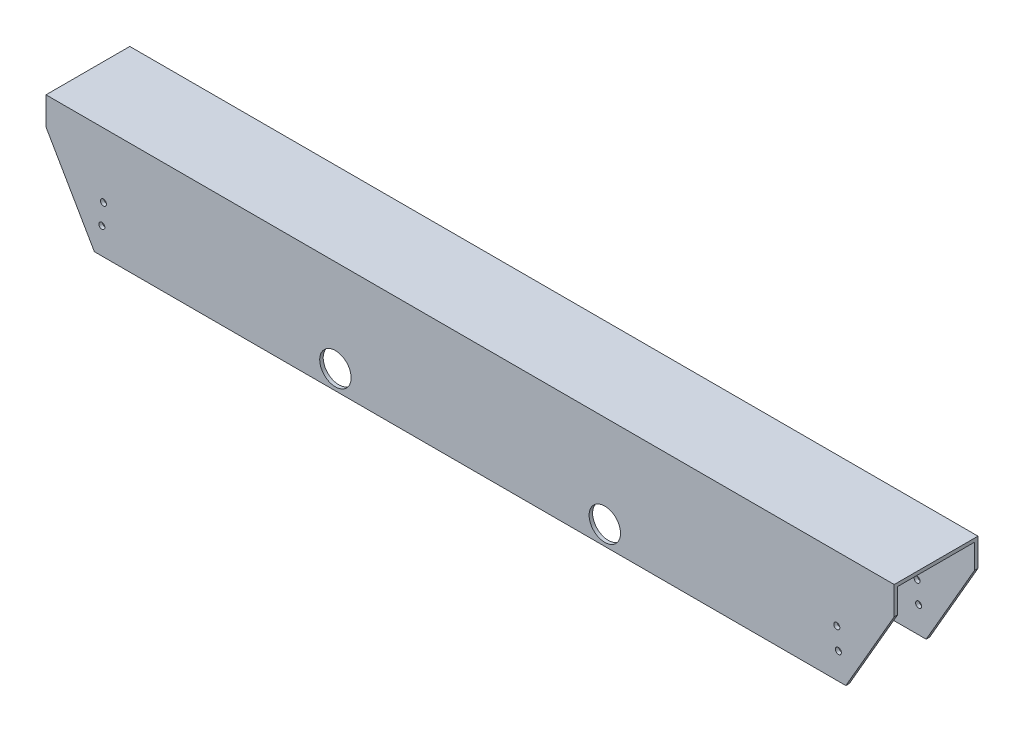
ISO-10303-21;
HEADER;
FILE_DESCRIPTION(('STEP AP214'),'2;1');
FILE_NAME('part.step','',(''),(''),'','','');
FILE_SCHEMA(('AUTOMOTIVE_DESIGN { 1 0 10303 214 1 1 1 1 }'));
ENDSEC;
DATA;
#1=APPLICATION_CONTEXT('core data for automotive mechanical design processes');
#2=APPLICATION_PROTOCOL_DEFINITION('international standard','automotive_design',2000,#1);
#3=PRODUCT_CONTEXT('',#1,'mechanical');
#4=PRODUCT('Part','Part','',(#3));
#5=PRODUCT_RELATED_PRODUCT_CATEGORY('part','',(#4));
#6=PRODUCT_DEFINITION_FORMATION('','',#4);
#7=PRODUCT_DEFINITION_CONTEXT('part definition',#1,'design');
#8=PRODUCT_DEFINITION('design','',#6,#7);
#9=PRODUCT_DEFINITION_SHAPE('','',#8);
#10=(LENGTH_UNIT() NAMED_UNIT(*) SI_UNIT(.MILLI.,.METRE.));
#11=(NAMED_UNIT(*) PLANE_ANGLE_UNIT() SI_UNIT($,.RADIAN.));
#12=(NAMED_UNIT(*) SI_UNIT($,.STERADIAN.) SOLID_ANGLE_UNIT());
#13=UNCERTAINTY_MEASURE_WITH_UNIT(LENGTH_MEASURE(1.E-05),#10,'distance_accuracy_value','');
#14=(GEOMETRIC_REPRESENTATION_CONTEXT(3) GLOBAL_UNCERTAINTY_ASSIGNED_CONTEXT((#13)) GLOBAL_UNIT_ASSIGNED_CONTEXT((#10,
#11,#12)) REPRESENTATION_CONTEXT('',''));
#15=CARTESIAN_POINT('',(0.,0.,0.));
#16=DIRECTION('',(0.,0.,1.));
#17=DIRECTION('',(1.,0.,0.));
#18=AXIS2_PLACEMENT_3D('',#15,#16,#17);
#19=CARTESIAN_POINT('',(385.705756272,50.8,-38.1));
#20=DIRECTION('',(0.,0.,1.));
#21=DIRECTION('',(0.,1.,0.));
#22=AXIS2_PLACEMENT_3D('',#19,#20,#21);
#23=PLANE('',#22);
#24=DIRECTION('',(0.,1.,0.));
#25=VECTOR('',#24,1.);
#26=CARTESIAN_POINT('',(0.,22.225,-38.1));
#27=LINE('',#26,#25);
#28=CARTESIAN_POINT('',(0.,22.225,-38.1));
#29=VERTEX_POINT('',#28);
#30=CARTESIAN_POINT('',(0.,47.625,-38.1));
#31=VERTEX_POINT('',#30);
#32=EDGE_CURVE('E360',#29,#31,#27,.T.);
#33=ORIENTED_EDGE('',*,*,#32,.F.);
#34=DIRECTION('',(-1.,0.,0.));
#35=VECTOR('',#34,1.);
#36=CARTESIAN_POINT('',(25.4,22.225,-38.1));
#37=LINE('',#36,#35);
#38=CARTESIAN_POINT('',(25.4,22.225,-38.1));
#39=VERTEX_POINT('',#38);
#40=EDGE_CURVE('E369',#39,#29,#37,.T.);
#41=ORIENTED_EDGE('',*,*,#40,.F.);
#42=DIRECTION('',(0.,-1.,0.));
#43=VECTOR('',#42,1.);
#44=CARTESIAN_POINT('',(25.4,22.225,-38.1));
#45=LINE('',#44,#43);
#46=CARTESIAN_POINT('',(25.4,47.625,-38.1));
#47=VERTEX_POINT('',#46);
#48=EDGE_CURVE('E366',#47,#39,#45,.T.);
#49=ORIENTED_EDGE('',*,*,#48,.F.);
#50=DIRECTION('',(1.,0.,0.));
#51=VECTOR('',#50,1.);
#52=CARTESIAN_POINT('',(25.4,47.625,-38.1));
#53=LINE('',#52,#51);
#54=EDGE_CURVE('E363',#31,#47,#53,.T.);
#55=ORIENTED_EDGE('',*,*,#54,.F.);
#56=EDGE_LOOP('',(#33,#41,#49,#55));
#57=FACE_BOUND('',#56,.T.);
#58=CARTESIAN_POINT('',(84.40039,-35.123476108,-38.1));
#59=DIRECTION('',(0.,0.,-1.));
#60=DIRECTION('',(-1.,0.,0.));
#61=AXIS2_PLACEMENT_3D('',#58,#59,#60);
#62=CIRCLE('',#61,3.302);
#63=CARTESIAN_POINT('',(81.09839,-35.123476108,-38.1));
#64=VERTEX_POINT('',#63);
#65=EDGE_CURVE('E254',#64,#64,#62,.T.);
#66=ORIENTED_EDGE('',*,*,#65,.F.);
#67=EDGE_LOOP('',(#66));
#68=FACE_BOUND('',#67,.T.);
#69=CARTESIAN_POINT('',(84.4118199998714,41.07652303475,-38.1));
#70=DIRECTION('',(0.,0.,-1.));
#71=DIRECTION('',(-1.,0.,0.));
#72=AXIS2_PLACEMENT_3D('',#69,#70,#71);
#73=CIRCLE('',#72,3.302);
#74=CARTESIAN_POINT('',(81.1098199998714,41.07652303475,-38.1));
#75=VERTEX_POINT('',#74);
#76=EDGE_CURVE('E250',#75,#75,#73,.T.);
#77=ORIENTED_EDGE('',*,*,#76,.F.);
#78=EDGE_LOOP('',(#77));
#79=FACE_BOUND('',#78,.T.);
#80=CARTESIAN_POINT('',(160.611819999871,41.07652303475,-38.1));
#81=DIRECTION('',(0.,0.,-1.));
#82=DIRECTION('',(-1.,0.,0.));
#83=AXIS2_PLACEMENT_3D('',#80,#81,#82);
#84=CIRCLE('',#83,3.30200000000001);
#85=CARTESIAN_POINT('',(157.309819999871,41.07652303475,-38.1));
#86=VERTEX_POINT('',#85);
#87=EDGE_CURVE('E246',#86,#86,#84,.T.);
#88=ORIENTED_EDGE('',*,*,#87,.F.);
#89=EDGE_LOOP('',(#88));
#90=FACE_BOUND('',#89,.T.);
#91=CARTESIAN_POINT('',(160.60039,-35.123476108,-38.1));
#92=DIRECTION('',(0.,0.,-1.));
#93=DIRECTION('',(-1.,0.,0.));
#94=AXIS2_PLACEMENT_3D('',#91,#92,#93);
#95=CIRCLE('',#94,3.30200000000001);
#96=CARTESIAN_POINT('',(157.29839,-35.123476108,-38.1));
#97=VERTEX_POINT('',#96);
#98=EDGE_CURVE('E242',#97,#97,#95,.T.);
#99=ORIENTED_EDGE('',*,*,#98,.F.);
#100=EDGE_LOOP('',(#99));
#101=FACE_BOUND('',#100,.T.);
#102=CARTESIAN_POINT('',(334.902632554865,-26.9275968191468,-38.1));
#103=DIRECTION('',(0.,0.,1.));
#104=DIRECTION('',(-1.,0.,0.));
#105=AXIS2_PLACEMENT_3D('',#102,#103,#104);
#106=CIRCLE('',#105,2.74999999999998);
#107=CARTESIAN_POINT('',(332.152632554865,-26.9275968191468,-38.1));
#108=VERTEX_POINT('',#107);
#109=EDGE_CURVE('E238',#108,#108,#106,.T.);
#110=ORIENTED_EDGE('',*,*,#109,.T.);
#111=EDGE_LOOP('',(#110));
#112=FACE_BOUND('',#111,.T.);
#113=CARTESIAN_POINT('',(-122.50039,-33.3375,-38.1));
#114=DIRECTION('',(0.,0.,1.));
#115=DIRECTION('',(1.,0.,0.));
#116=AXIS2_PLACEMENT_3D('',#113,#114,#115);
#117=CIRCLE('',#116,14.2875);
#118=CARTESIAN_POINT('',(-108.21289,-33.3375,-38.1));
#119=VERTEX_POINT('',#118);
#120=EDGE_CURVE('E233',#119,#119,#117,.T.);
#121=ORIENTED_EDGE('',*,*,#120,.T.);
#122=EDGE_LOOP('',(#121));
#123=FACE_BOUND('',#122,.T.);
#124=CARTESIAN_POINT('',(-334.902632554865,-26.9275968191468,-38.1));
#125=DIRECTION('',(0.,0.,1.));
#126=DIRECTION('',(1.,0.,0.));
#127=AXIS2_PLACEMENT_3D('',#124,#125,#126);
#128=CIRCLE('',#127,2.74999999999998);
#129=CARTESIAN_POINT('',(-332.152632554865,-26.9275968191468,-38.1));
#130=VERTEX_POINT('',#129);
#131=EDGE_CURVE('E228',#130,#130,#128,.T.);
#132=ORIENTED_EDGE('',*,*,#131,.T.);
#133=EDGE_LOOP('',(#132));
#134=FACE_BOUND('',#133,.T.);
#135=CARTESIAN_POINT('',(333.475837626314,-7.93749999999992,-38.1));
#136=DIRECTION('',(0.,0.,1.));
#137=DIRECTION('',(-1.,0.,0.));
#138=AXIS2_PLACEMENT_3D('',#135,#136,#137);
#139=CIRCLE('',#138,2.74999996099998);
#140=CARTESIAN_POINT('',(330.725837665314,-7.93749999999992,-38.1));
#141=VERTEX_POINT('',#140);
#142=EDGE_CURVE('E223',#141,#141,#139,.T.);
#143=ORIENTED_EDGE('',*,*,#142,.T.);
#144=EDGE_LOOP('',(#143));
#145=FACE_BOUND('',#144,.T.);
#146=CARTESIAN_POINT('',(122.50039,-33.3375,-38.1));
#147=DIRECTION('',(0.,0.,1.));
#148=DIRECTION('',(-1.,0.,0.));
#149=AXIS2_PLACEMENT_3D('',#146,#147,#148);
#150=CIRCLE('',#149,14.2875);
#151=CARTESIAN_POINT('',(108.21289,-33.3375,-38.1));
#152=VERTEX_POINT('',#151);
#153=EDGE_CURVE('E218',#152,#152,#150,.T.);
#154=ORIENTED_EDGE('',*,*,#153,.T.);
#155=EDGE_LOOP('',(#154));
#156=FACE_BOUND('',#155,.T.);
#157=CARTESIAN_POINT('',(-333.475837626314,-7.9375,-38.1));
#158=DIRECTION('',(0.,0.,1.));
#159=DIRECTION('',(1.,0.,0.));
#160=AXIS2_PLACEMENT_3D('',#157,#158,#159);
#161=CIRCLE('',#160,2.74999996099998);
#162=CARTESIAN_POINT('',(-330.725837665314,-7.9375,-38.1));
#163=VERTEX_POINT('',#162);
#164=EDGE_CURVE('E213',#163,#163,#161,.T.);
#165=ORIENTED_EDGE('',*,*,#164,.T.);
#166=EDGE_LOOP('',(#165));
#167=FACE_BOUND('',#166,.T.);
#168=DIRECTION('',(-1.,0.,0.));
#169=VECTOR('',#168,1.);
#170=CARTESIAN_POINT('',(385.705756272,-50.8,-38.1));
#171=LINE('',#170,#169);
#172=CARTESIAN_POINT('',(341.71166575975,-50.7999999999999,-38.1));
#173=VERTEX_POINT('',#172);
#174=CARTESIAN_POINT('',(-341.71166575975,-50.8,-38.1));
#175=VERTEX_POINT('',#174);
#176=EDGE_CURVE('E185',#173,#175,#171,.T.);
#177=ORIENTED_EDGE('',*,*,#176,.T.);
#178=DIRECTION('',(-0.500000000000004,0.866025403784436,0.));
#179=VECTOR('',#178,1.);
#180=CARTESIAN_POINT('',(-385.705756272,25.4,-38.1));
#181=LINE('',#180,#179);
#182=CARTESIAN_POINT('',(-385.705756272,25.4,-38.1));
#183=VERTEX_POINT('',#182);
#184=EDGE_CURVE('E448',#175,#183,#181,.T.);
#185=ORIENTED_EDGE('',*,*,#184,.T.);
#186=DIRECTION('',(0.,-1.,0.));
#187=VECTOR('',#186,1.);
#188=CARTESIAN_POINT('',(-385.705756272,50.8,-38.1));
#189=LINE('',#188,#187);
#190=CARTESIAN_POINT('',(-385.705756272,50.8,-38.1));
#191=VERTEX_POINT('',#190);
#192=EDGE_CURVE('E293',#191,#183,#189,.T.);
#193=ORIENTED_EDGE('',*,*,#192,.F.);
#194=DIRECTION('',(-1.,0.,0.));
#195=VECTOR('',#194,1.);
#196=CARTESIAN_POINT('',(385.705756272,50.8,-38.1));
#197=LINE('',#196,#195);
#198=CARTESIAN_POINT('',(385.705756272,50.8,-38.1));
#199=VERTEX_POINT('',#198);
#200=EDGE_CURVE('E193',#199,#191,#197,.T.);
#201=ORIENTED_EDGE('',*,*,#200,.F.);
#202=DIRECTION('',(0.,-1.,0.));
#203=VECTOR('',#202,1.);
#204=CARTESIAN_POINT('',(385.705756272,50.8,-38.1));
#205=LINE('',#204,#203);
#206=CARTESIAN_POINT('',(385.705756272,25.4000000000001,-38.1));
#207=VERTEX_POINT('',#206);
#208=EDGE_CURVE('E188',#199,#207,#205,.T.);
#209=ORIENTED_EDGE('',*,*,#208,.T.);
#210=DIRECTION('',(-0.500000000000004,-0.866025403784436,0.));
#211=VECTOR('',#210,1.);
#212=CARTESIAN_POINT('',(385.705756272,25.4000000000001,-38.1));
#213=LINE('',#212,#211);
#214=EDGE_CURVE('E172',#207,#173,#213,.T.);
#215=ORIENTED_EDGE('',*,*,#214,.T.);
#216=EDGE_LOOP('',(#177,#185,#193,#201,#209,#215));
#217=FACE_BOUND('',#216,.T.);
#218=DIRECTION('',(0.,1.,0.));
#219=VECTOR('',#218,1.);
#220=CARTESIAN_POINT('',(-292.1,22.225,-38.1));
#221=LINE('',#220,#219);
#222=CARTESIAN_POINT('',(-292.1,22.225,-38.1));
#223=VERTEX_POINT('',#222);
#224=CARTESIAN_POINT('',(-292.1,47.625,-38.1));
#225=VERTEX_POINT('',#224);
#226=EDGE_CURVE('E332',#223,#225,#221,.T.);
#227=ORIENTED_EDGE('',*,*,#226,.F.);
#228=DIRECTION('',(-1.,0.,0.));
#229=VECTOR('',#228,1.);
#230=CARTESIAN_POINT('',(-266.7,22.225,-38.1));
#231=LINE('',#230,#229);
#232=CARTESIAN_POINT('',(-266.7,22.225,-38.1));
#233=VERTEX_POINT('',#232);
#234=EDGE_CURVE('E346',#233,#223,#231,.T.);
#235=ORIENTED_EDGE('',*,*,#234,.F.);
#236=DIRECTION('',(0.,-1.,0.));
#237=VECTOR('',#236,1.);
#238=CARTESIAN_POINT('',(-266.7,22.225,-38.1));
#239=LINE('',#238,#237);
#240=CARTESIAN_POINT('',(-266.7,47.625,-38.1));
#241=VERTEX_POINT('',#240);
#242=EDGE_CURVE('E343',#241,#233,#239,.T.);
#243=ORIENTED_EDGE('',*,*,#242,.F.);
#244=DIRECTION('',(1.,0.,0.));
#245=VECTOR('',#244,1.);
#246=CARTESIAN_POINT('',(-266.7,47.625,-38.1));
#247=LINE('',#246,#245);
#248=EDGE_CURVE('E336',#225,#241,#247,.T.);
#249=ORIENTED_EDGE('',*,*,#248,.F.);
#250=EDGE_LOOP('',(#227,#235,#243,#249));
#251=FACE_BOUND('',#250,.T.);
#252=ADVANCED_FACE('F37',(#57,#68,#79,#90,#101,#112,#123,#134,#145,#156,#167,#217,#251),#23,.F.);
#253=CARTESIAN_POINT('',(385.705756272,47.625,-34.925));
#254=DIRECTION('',(0.,0.,-1.));
#255=DIRECTION('',(0.,-1.,0.));
#256=AXIS2_PLACEMENT_3D('',#253,#254,#255);
#257=PLANE('',#256);
#258=CARTESIAN_POINT('',(84.40039,-35.123476108,-34.925));
#259=DIRECTION('',(0.,0.,1.));
#260=DIRECTION('',(0.,-1.,0.));
#261=AXIS2_PLACEMENT_3D('',#258,#259,#260);
#262=CIRCLE('',#261,3.302);
#263=CARTESIAN_POINT('',(84.40039,-38.425476108,-34.925));
#264=VERTEX_POINT('',#263);
#265=EDGE_CURVE('E251',#264,#264,#262,.F.);
#266=ORIENTED_EDGE('',*,*,#265,.T.);
#267=EDGE_LOOP('',(#266));
#268=FACE_BOUND('',#267,.T.);
#269=CARTESIAN_POINT('',(84.4118199998714,41.07652303475,-34.925));
#270=DIRECTION('',(0.,0.,1.));
#271=DIRECTION('',(0.,-1.,0.));
#272=AXIS2_PLACEMENT_3D('',#269,#270,#271);
#273=CIRCLE('',#272,3.302);
#274=CARTESIAN_POINT('',(84.4118199998714,37.77452303475,-34.925));
#275=VERTEX_POINT('',#274);
#276=EDGE_CURVE('E247',#275,#275,#273,.F.);
#277=ORIENTED_EDGE('',*,*,#276,.T.);
#278=EDGE_LOOP('',(#277));
#279=FACE_BOUND('',#278,.T.);
#280=CARTESIAN_POINT('',(160.611819999871,41.07652303475,-34.925));
#281=DIRECTION('',(0.,0.,1.));
#282=DIRECTION('',(0.,-1.,0.));
#283=AXIS2_PLACEMENT_3D('',#280,#281,#282);
#284=CIRCLE('',#283,3.30200000000001);
#285=CARTESIAN_POINT('',(160.611819999871,37.77452303475,-34.925));
#286=VERTEX_POINT('',#285);
#287=EDGE_CURVE('E243',#286,#286,#284,.F.);
#288=ORIENTED_EDGE('',*,*,#287,.T.);
#289=EDGE_LOOP('',(#288));
#290=FACE_BOUND('',#289,.T.);
#291=CARTESIAN_POINT('',(160.60039,-35.123476108,-34.925));
#292=DIRECTION('',(0.,0.,1.));
#293=DIRECTION('',(0.,-1.,0.));
#294=AXIS2_PLACEMENT_3D('',#291,#292,#293);
#295=CIRCLE('',#294,3.30200000000001);
#296=CARTESIAN_POINT('',(160.60039,-38.425476108,-34.925));
#297=VERTEX_POINT('',#296);
#298=EDGE_CURVE('E239',#297,#297,#295,.F.);
#299=ORIENTED_EDGE('',*,*,#298,.T.);
#300=EDGE_LOOP('',(#299));
#301=FACE_BOUND('',#300,.T.);
#302=CARTESIAN_POINT('',(334.902632554865,-26.9275968191468,-34.925));
#303=DIRECTION('',(0.,0.,1.));
#304=DIRECTION('',(0.,-1.,0.));
#305=AXIS2_PLACEMENT_3D('',#302,#303,#304);
#306=CIRCLE('',#305,2.74999999999998);
#307=CARTESIAN_POINT('',(334.902632554865,-29.6775968191468,-34.925));
#308=VERTEX_POINT('',#307);
#309=EDGE_CURVE('E237',#308,#308,#306,.T.);
#310=ORIENTED_EDGE('',*,*,#309,.F.);
#311=EDGE_LOOP('',(#310));
#312=FACE_BOUND('',#311,.T.);
#313=CARTESIAN_POINT('',(-122.50039,-33.3375,-34.925));
#314=DIRECTION('',(0.,0.,1.));
#315=DIRECTION('',(0.,-1.,0.));
#316=AXIS2_PLACEMENT_3D('',#313,#314,#315);
#317=CIRCLE('',#316,14.2875);
#318=CARTESIAN_POINT('',(-122.50039,-47.625,-34.925));
#319=VERTEX_POINT('',#318);
#320=EDGE_CURVE('E232',#319,#319,#317,.T.);
#321=ORIENTED_EDGE('',*,*,#320,.F.);
#322=EDGE_LOOP('',(#321));
#323=FACE_BOUND('',#322,.T.);
#324=CARTESIAN_POINT('',(-334.902632554865,-26.9275968191468,-34.925));
#325=DIRECTION('',(0.,0.,1.));
#326=DIRECTION('',(0.,-1.,0.));
#327=AXIS2_PLACEMENT_3D('',#324,#325,#326);
#328=CIRCLE('',#327,2.74999999999998);
#329=CARTESIAN_POINT('',(-334.902632554865,-29.6775968191468,-34.925));
#330=VERTEX_POINT('',#329);
#331=EDGE_CURVE('E227',#330,#330,#328,.T.);
#332=ORIENTED_EDGE('',*,*,#331,.F.);
#333=EDGE_LOOP('',(#332));
#334=FACE_BOUND('',#333,.T.);
#335=CARTESIAN_POINT('',(333.475837626314,-7.93749999999992,-34.925));
#336=DIRECTION('',(0.,0.,1.));
#337=DIRECTION('',(0.,-1.,0.));
#338=AXIS2_PLACEMENT_3D('',#335,#336,#337);
#339=CIRCLE('',#338,2.74999996099998);
#340=CARTESIAN_POINT('',(333.475837626314,-10.6874999609999,-34.925));
#341=VERTEX_POINT('',#340);
#342=EDGE_CURVE('E222',#341,#341,#339,.T.);
#343=ORIENTED_EDGE('',*,*,#342,.F.);
#344=EDGE_LOOP('',(#343));
#345=FACE_BOUND('',#344,.T.);
#346=CARTESIAN_POINT('',(122.50039,-33.3375,-34.925));
#347=DIRECTION('',(0.,0.,1.));
#348=DIRECTION('',(0.,-1.,0.));
#349=AXIS2_PLACEMENT_3D('',#346,#347,#348);
#350=CIRCLE('',#349,14.2875);
#351=CARTESIAN_POINT('',(122.50039,-47.625,-34.925));
#352=VERTEX_POINT('',#351);
#353=EDGE_CURVE('E217',#352,#352,#350,.T.);
#354=ORIENTED_EDGE('',*,*,#353,.F.);
#355=EDGE_LOOP('',(#354));
#356=FACE_BOUND('',#355,.T.);
#357=CARTESIAN_POINT('',(-333.475837626314,-7.9375,-34.925));
#358=DIRECTION('',(0.,0.,1.));
#359=DIRECTION('',(0.,-1.,0.));
#360=AXIS2_PLACEMENT_3D('',#357,#358,#359);
#361=CIRCLE('',#360,2.74999996099998);
#362=CARTESIAN_POINT('',(-333.475837626314,-10.687499961,-34.925));
#363=VERTEX_POINT('',#362);
#364=EDGE_CURVE('E212',#363,#363,#361,.T.);
#365=ORIENTED_EDGE('',*,*,#364,.F.);
#366=EDGE_LOOP('',(#365));
#367=FACE_BOUND('',#366,.T.);
#368=DIRECTION('',(0.,1.,0.));
#369=VECTOR('',#368,1.);
#370=CARTESIAN_POINT('',(385.705756272,47.625,-34.925));
#371=LINE('',#370,#369);
#372=CARTESIAN_POINT('',(385.705756272,25.4000000000001,-34.925));
#373=VERTEX_POINT('',#372);
#374=CARTESIAN_POINT('',(385.705756272,47.625,-34.925));
#375=VERTEX_POINT('',#374);
#376=EDGE_CURVE('E271',#373,#375,#371,.T.);
#377=ORIENTED_EDGE('',*,*,#376,.T.);
#378=DIRECTION('',(-1.,0.,0.));
#379=VECTOR('',#378,1.);
#380=CARTESIAN_POINT('',(385.705756272,47.625,-34.925));
#381=LINE('',#380,#379);
#382=CARTESIAN_POINT('',(25.4,47.625,-34.925));
#383=VERTEX_POINT('',#382);
#384=EDGE_CURVE('E199',#375,#383,#381,.T.);
#385=ORIENTED_EDGE('',*,*,#384,.T.);
#386=DIRECTION('',(0.,-1.,0.));
#387=VECTOR('',#386,1.);
#388=CARTESIAN_POINT('',(25.4,47.625,-34.925));
#389=LINE('',#388,#387);
#390=CARTESIAN_POINT('',(25.4,22.225,-34.925));
#391=VERTEX_POINT('',#390);
#392=EDGE_CURVE('E380',#383,#391,#389,.T.);
#393=ORIENTED_EDGE('',*,*,#392,.T.);
#394=DIRECTION('',(-1.,0.,0.));
#395=VECTOR('',#394,1.);
#396=CARTESIAN_POINT('',(385.705756272,22.225,-34.925));
#397=LINE('',#396,#395);
#398=CARTESIAN_POINT('',(0.,22.225,-34.925));
#399=VERTEX_POINT('',#398);
#400=EDGE_CURVE('E208',#391,#399,#397,.T.);
#401=ORIENTED_EDGE('',*,*,#400,.T.);
#402=DIRECTION('',(0.,1.,0.));
#403=VECTOR('',#402,1.);
#404=CARTESIAN_POINT('',(0.,47.625,-34.925));
#405=LINE('',#404,#403);
#406=CARTESIAN_POINT('',(0.,47.625,-34.925));
#407=VERTEX_POINT('',#406);
#408=EDGE_CURVE('E382',#399,#407,#405,.T.);
#409=ORIENTED_EDGE('',*,*,#408,.T.);
#410=CARTESIAN_POINT('',(-266.7,47.625,-34.925));
#411=VERTEX_POINT('',#410);
#412=EDGE_CURVE('E309',#407,#411,#381,.T.);
#413=ORIENTED_EDGE('',*,*,#412,.T.);
#414=DIRECTION('',(0.,-1.,0.));
#415=VECTOR('',#414,1.);
#416=CARTESIAN_POINT('',(-266.7,47.625,-34.925));
#417=LINE('',#416,#415);
#418=CARTESIAN_POINT('',(-266.7,22.225,-34.925));
#419=VERTEX_POINT('',#418);
#420=EDGE_CURVE('E356',#411,#419,#417,.T.);
#421=ORIENTED_EDGE('',*,*,#420,.T.);
#422=DIRECTION('',(-1.,0.,0.));
#423=VECTOR('',#422,1.);
#424=CARTESIAN_POINT('',(385.705756272,22.225,-34.925));
#425=LINE('',#424,#423);
#426=CARTESIAN_POINT('',(-292.1,22.225,-34.925));
#427=VERTEX_POINT('',#426);
#428=EDGE_CURVE('E257',#419,#427,#425,.T.);
#429=ORIENTED_EDGE('',*,*,#428,.T.);
#430=DIRECTION('',(0.,1.,0.));
#431=VECTOR('',#430,1.);
#432=CARTESIAN_POINT('',(-292.1,47.625,-34.925));
#433=LINE('',#432,#431);
#434=CARTESIAN_POINT('',(-292.1,47.625,-34.925));
#435=VERTEX_POINT('',#434);
#436=EDGE_CURVE('E319',#427,#435,#433,.T.);
#437=ORIENTED_EDGE('',*,*,#436,.T.);
#438=CARTESIAN_POINT('',(-385.705756272,47.625,-34.925));
#439=VERTEX_POINT('',#438);
#440=EDGE_CURVE('E308',#435,#439,#381,.T.);
#441=ORIENTED_EDGE('',*,*,#440,.T.);
#442=DIRECTION('',(0.,1.,0.));
#443=VECTOR('',#442,1.);
#444=CARTESIAN_POINT('',(-385.705756272,47.625,-34.925));
#445=LINE('',#444,#443);
#446=CARTESIAN_POINT('',(-385.705756272,25.4,-34.925));
#447=VERTEX_POINT('',#446);
#448=EDGE_CURVE('E295',#447,#439,#445,.T.);
#449=ORIENTED_EDGE('',*,*,#448,.F.);
#450=DIRECTION('',(-0.500000000000004,0.866025403784436,0.));
#451=VECTOR('',#450,1.);
#452=CARTESIAN_POINT('',(-202.476585435551,-291.962233317443,-34.925));
#453=LINE('',#452,#451);
#454=CARTESIAN_POINT('',(-341.71166575975,-50.8,-34.925));
#455=VERTEX_POINT('',#454);
#456=EDGE_CURVE('E330',#455,#447,#453,.T.);
#457=ORIENTED_EDGE('',*,*,#456,.F.);
#458=DIRECTION('',(-1.,0.,0.));
#459=VECTOR('',#458,1.);
#460=CARTESIAN_POINT('',(385.705756272,-50.8,-34.925));
#461=LINE('',#460,#459);
#462=CARTESIAN_POINT('',(341.71166575975,-50.7999999999999,-34.925));
#463=VERTEX_POINT('',#462);
#464=EDGE_CURVE('E194',#463,#455,#461,.T.);
#465=ORIENTED_EDGE('',*,*,#464,.F.);
#466=DIRECTION('',(-0.500000000000004,-0.866025403784436,0.));
#467=VECTOR('',#466,1.);
#468=CARTESIAN_POINT('',(395.329463571555,42.0687499999999,-34.925));
#469=LINE('',#468,#467);
#470=EDGE_CURVE('E174',#373,#463,#469,.T.);
#471=ORIENTED_EDGE('',*,*,#470,.F.);
#472=EDGE_LOOP('',(#377,#385,#393,#401,#409,#413,#421,#429,#437,#441,#449,#457,#465,#471));
#473=FACE_BOUND('',#472,.T.);
#474=ADVANCED_FACE('F316',(#268,#279,#290,#301,#312,#323,#334,#345,#356,#367,#473),#257,.F.);
#475=CARTESIAN_POINT('',(385.705756272,-50.8,38.1));
#476=DIRECTION('',(0.,1.,0.));
#477=DIRECTION('',(0.,0.,-1.));
#478=AXIS2_PLACEMENT_3D('',#475,#476,#477);
#479=PLANE('',#478);
#480=DIRECTION('',(-1.,0.,0.));
#481=VECTOR('',#480,1.);
#482=CARTESIAN_POINT('',(385.705756272,-50.8,38.1));
#483=LINE('',#482,#481);
#484=CARTESIAN_POINT('',(341.71166575975,-50.7999999999999,38.1));
#485=VERTEX_POINT('',#484);
#486=CARTESIAN_POINT('',(-341.71166575975,-50.8,38.1));
#487=VERTEX_POINT('',#486);
#488=EDGE_CURVE('E205',#485,#487,#483,.T.);
#489=ORIENTED_EDGE('',*,*,#488,.T.);
#490=DIRECTION('',(0.,0.,-1.));
#491=VECTOR('',#490,1.);
#492=CARTESIAN_POINT('',(-341.71166575975,-50.8,63.5));
#493=LINE('',#492,#491);
#494=CARTESIAN_POINT('',(-341.71166575975,-50.8,34.925));
#495=VERTEX_POINT('',#494);
#496=EDGE_CURVE('E453',#487,#495,#493,.T.);
#497=ORIENTED_EDGE('',*,*,#496,.T.);
#498=DIRECTION('',(-1.,0.,0.));
#499=VECTOR('',#498,1.);
#500=CARTESIAN_POINT('',(385.705756272,-50.8,34.925));
#501=LINE('',#500,#499);
#502=CARTESIAN_POINT('',(341.71166575975,-50.7999999999999,34.925));
#503=VERTEX_POINT('',#502);
#504=EDGE_CURVE('E286',#503,#495,#501,.T.);
#505=ORIENTED_EDGE('',*,*,#504,.F.);
#506=DIRECTION('',(0.,0.,-1.));
#507=VECTOR('',#506,1.);
#508=CARTESIAN_POINT('',(341.71166575975,-50.7999999999999,63.5));
#509=LINE('',#508,#507);
#510=EDGE_CURVE('E179',#485,#503,#509,.T.);
#511=ORIENTED_EDGE('',*,*,#510,.F.);
#512=EDGE_LOOP('',(#489,#497,#505,#511));
#513=FACE_BOUND('',#512,.T.);
#514=ADVANCED_FACE('F39',(#513),#479,.F.);
#515=CARTESIAN_POINT('',(385.705756272,50.8,38.1));
#516=DIRECTION('',(0.,0.,-1.));
#517=DIRECTION('',(0.,-1.,0.));
#518=AXIS2_PLACEMENT_3D('',#515,#516,#517);
#519=PLANE('',#518);
#520=CARTESIAN_POINT('',(334.902632554865,-26.9275968191468,38.1));
#521=DIRECTION('',(0.,0.,1.));
#522=DIRECTION('',(0.,-1.,0.));
#523=AXIS2_PLACEMENT_3D('',#520,#521,#522);
#524=CIRCLE('',#523,2.74999999999998);
#525=CARTESIAN_POINT('',(334.902632554865,-29.6775968191468,38.1));
#526=VERTEX_POINT('',#525);
#527=EDGE_CURVE('E397',#526,#526,#524,.T.);
#528=ORIENTED_EDGE('',*,*,#527,.F.);
#529=EDGE_LOOP('',(#528));
#530=FACE_BOUND('',#529,.T.);
#531=CARTESIAN_POINT('',(-122.50039,-33.3375,38.1));
#532=DIRECTION('',(0.,0.,1.));
#533=DIRECTION('',(0.,-1.,0.));
#534=AXIS2_PLACEMENT_3D('',#531,#532,#533);
#535=CIRCLE('',#534,14.2875);
#536=CARTESIAN_POINT('',(-122.50039,-47.625,38.1));
#537=VERTEX_POINT('',#536);
#538=EDGE_CURVE('E404',#537,#537,#535,.T.);
#539=ORIENTED_EDGE('',*,*,#538,.F.);
#540=EDGE_LOOP('',(#539));
#541=FACE_BOUND('',#540,.T.);
#542=CARTESIAN_POINT('',(-334.902632554865,-26.9275968191468,38.1));
#543=DIRECTION('',(0.,0.,1.));
#544=DIRECTION('',(0.,-1.,0.));
#545=AXIS2_PLACEMENT_3D('',#542,#543,#544);
#546=CIRCLE('',#545,2.74999999999998);
#547=CARTESIAN_POINT('',(-334.902632554865,-29.6775968191468,38.1));
#548=VERTEX_POINT('',#547);
#549=EDGE_CURVE('E411',#548,#548,#546,.T.);
#550=ORIENTED_EDGE('',*,*,#549,.F.);
#551=EDGE_LOOP('',(#550));
#552=FACE_BOUND('',#551,.T.);
#553=CARTESIAN_POINT('',(333.475837626314,-7.93749999999992,38.1));
#554=DIRECTION('',(0.,0.,1.));
#555=DIRECTION('',(0.,-1.,0.));
#556=AXIS2_PLACEMENT_3D('',#553,#554,#555);
#557=CIRCLE('',#556,2.74999996099998);
#558=CARTESIAN_POINT('',(333.475837626314,-10.6874999609999,38.1));
#559=VERTEX_POINT('',#558);
#560=EDGE_CURVE('E418',#559,#559,#557,.T.);
#561=ORIENTED_EDGE('',*,*,#560,.F.);
#562=EDGE_LOOP('',(#561));
#563=FACE_BOUND('',#562,.T.);
#564=CARTESIAN_POINT('',(122.50039,-33.3375,38.1));
#565=DIRECTION('',(0.,0.,1.));
#566=DIRECTION('',(0.,-1.,0.));
#567=AXIS2_PLACEMENT_3D('',#564,#565,#566);
#568=CIRCLE('',#567,14.2875);
#569=CARTESIAN_POINT('',(122.50039,-47.625,38.1));
#570=VERTEX_POINT('',#569);
#571=EDGE_CURVE('E425',#570,#570,#568,.T.);
#572=ORIENTED_EDGE('',*,*,#571,.F.);
#573=EDGE_LOOP('',(#572));
#574=FACE_BOUND('',#573,.T.);
#575=CARTESIAN_POINT('',(-333.475837626314,-7.9375,38.1));
#576=DIRECTION('',(0.,0.,1.));
#577=DIRECTION('',(0.,-1.,0.));
#578=AXIS2_PLACEMENT_3D('',#575,#576,#577);
#579=CIRCLE('',#578,2.74999996099998);
#580=CARTESIAN_POINT('',(-333.475837626314,-10.687499961,38.1));
#581=VERTEX_POINT('',#580);
#582=EDGE_CURVE('E291',#581,#581,#579,.T.);
#583=ORIENTED_EDGE('',*,*,#582,.F.);
#584=EDGE_LOOP('',(#583));
#585=FACE_BOUND('',#584,.T.);
#586=DIRECTION('',(0.,1.,0.));
#587=VECTOR('',#586,1.);
#588=CARTESIAN_POINT('',(385.705756272,50.8,38.1));
#589=LINE('',#588,#587);
#590=CARTESIAN_POINT('',(385.705756272,25.4000000000001,38.1));
#591=VERTEX_POINT('',#590);
#592=CARTESIAN_POINT('',(385.705756272,50.8,38.1));
#593=VERTEX_POINT('',#592);
#594=EDGE_CURVE('E303',#591,#593,#589,.T.);
#595=ORIENTED_EDGE('',*,*,#594,.T.);
#596=DIRECTION('',(-1.,0.,0.));
#597=VECTOR('',#596,1.);
#598=CARTESIAN_POINT('',(385.705756272,50.8,38.1));
#599=LINE('',#598,#597);
#600=CARTESIAN_POINT('',(-385.705756272,50.8,38.1));
#601=VERTEX_POINT('',#600);
#602=EDGE_CURVE('E197',#593,#601,#599,.T.);
#603=ORIENTED_EDGE('',*,*,#602,.T.);
#604=DIRECTION('',(0.,1.,0.));
#605=VECTOR('',#604,1.);
#606=CARTESIAN_POINT('',(-385.705756272,50.8,38.1));
#607=LINE('',#606,#605);
#608=CARTESIAN_POINT('',(-385.705756272,25.4,38.1));
#609=VERTEX_POINT('',#608);
#610=EDGE_CURVE('E287',#609,#601,#607,.T.);
#611=ORIENTED_EDGE('',*,*,#610,.F.);
#612=DIRECTION('',(-0.500000000000004,0.866025403784436,0.));
#613=VECTOR('',#612,1.);
#614=CARTESIAN_POINT('',(-203.851400764059,-289.580983317443,38.1));
#615=LINE('',#614,#613);
#616=EDGE_CURVE('E333',#487,#609,#615,.T.);
#617=ORIENTED_EDGE('',*,*,#616,.F.);
#618=ORIENTED_EDGE('',*,*,#488,.F.);
#619=DIRECTION('',(-0.500000000000004,-0.866025403784436,0.));
#620=VECTOR('',#619,1.);
#621=CARTESIAN_POINT('',(396.704278900062,44.4499999999999,38.1));
#622=LINE('',#621,#620);
#623=EDGE_CURVE('E443',#591,#485,#622,.T.);
#624=ORIENTED_EDGE('',*,*,#623,.F.);
#625=EDGE_LOOP('',(#595,#603,#611,#617,#618,#624));
#626=FACE_BOUND('',#625,.T.);
#627=ADVANCED_FACE('F440',(#530,#541,#552,#563,#574,#585,#626),#519,.F.);
#628=CARTESIAN_POINT('',(385.705756272,50.8,-38.1));
#629=DIRECTION('',(0.,-1.,0.));
#630=DIRECTION('',(0.,0.,1.));
#631=AXIS2_PLACEMENT_3D('',#628,#629,#630);
#632=PLANE('',#631);
#633=DIRECTION('',(0.,0.,-1.));
#634=VECTOR('',#633,1.);
#635=CARTESIAN_POINT('',(-385.705756272,50.8,-38.1));
#636=LINE('',#635,#634);
#637=EDGE_CURVE('E290',#601,#191,#636,.T.);
#638=ORIENTED_EDGE('',*,*,#637,.F.);
#639=ORIENTED_EDGE('',*,*,#602,.F.);
#640=DIRECTION('',(0.,0.,-1.));
#641=VECTOR('',#640,1.);
#642=CARTESIAN_POINT('',(385.705756272,50.8,-38.1));
#643=LINE('',#642,#641);
#644=EDGE_CURVE('E280',#593,#199,#643,.T.);
#645=ORIENTED_EDGE('',*,*,#644,.T.);
#646=ORIENTED_EDGE('',*,*,#200,.T.);
#647=EDGE_LOOP('',(#638,#639,#645,#646));
#648=FACE_BOUND('',#647,.T.);
#649=ADVANCED_FACE('F437',(#648),#632,.F.);
#650=CARTESIAN_POINT('',(385.705756272,-50.8,-38.1));
#651=DIRECTION('',(0.,1.,0.));
#652=DIRECTION('',(0.,0.,-1.));
#653=AXIS2_PLACEMENT_3D('',#650,#651,#652);
#654=PLANE('',#653);
#655=ORIENTED_EDGE('',*,*,#464,.T.);
#656=EDGE_CURVE('E191',#455,#175,#493,.T.);
#657=ORIENTED_EDGE('',*,*,#656,.T.);
#658=ORIENTED_EDGE('',*,*,#176,.F.);
#659=EDGE_CURVE('E169',#463,#173,#509,.T.);
#660=ORIENTED_EDGE('',*,*,#659,.F.);
#661=EDGE_LOOP('',(#655,#657,#658,#660));
#662=FACE_BOUND('',#661,.T.);
#663=ADVANCED_FACE('F190',(#662),#654,.F.);
#664=CARTESIAN_POINT('',(385.705756272,47.625,-34.925));
#665=DIRECTION('',(0.,1.,0.));
#666=DIRECTION('',(0.,0.,-1.));
#667=AXIS2_PLACEMENT_3D('',#664,#665,#666);
#668=PLANE('',#667);
#669=ORIENTED_EDGE('',*,*,#412,.F.);
#670=DIRECTION('',(0.,0.,-1.));
#671=VECTOR('',#670,1.);
#672=CARTESIAN_POINT('',(0.,47.625,-4.85637699543683));
#673=LINE('',#672,#671);
#674=EDGE_CURVE('E378',#407,#31,#673,.T.);
#675=ORIENTED_EDGE('',*,*,#674,.T.);
#676=ORIENTED_EDGE('',*,*,#54,.T.);
#677=DIRECTION('',(0.,0.,-1.));
#678=VECTOR('',#677,1.);
#679=CARTESIAN_POINT('',(25.4,47.625,-4.85637699543683));
#680=LINE('',#679,#678);
#681=EDGE_CURVE('E376',#383,#47,#680,.T.);
#682=ORIENTED_EDGE('',*,*,#681,.F.);
#683=ORIENTED_EDGE('',*,*,#384,.F.);
#684=DIRECTION('',(0.,0.,1.));
#685=VECTOR('',#684,1.);
#686=CARTESIAN_POINT('',(385.705756272,47.625,-34.925));
#687=LINE('',#686,#685);
#688=CARTESIAN_POINT('',(385.705756272,47.625,34.925));
#689=VERTEX_POINT('',#688);
#690=EDGE_CURVE('E273',#375,#689,#687,.T.);
#691=ORIENTED_EDGE('',*,*,#690,.T.);
#692=DIRECTION('',(-1.,0.,0.));
#693=VECTOR('',#692,1.);
#694=CARTESIAN_POINT('',(385.705756272,47.625,34.925));
#695=LINE('',#694,#693);
#696=CARTESIAN_POINT('',(-385.705756272,47.625,34.925));
#697=VERTEX_POINT('',#696);
#698=EDGE_CURVE('E306',#689,#697,#695,.T.);
#699=ORIENTED_EDGE('',*,*,#698,.T.);
#700=DIRECTION('',(0.,0.,1.));
#701=VECTOR('',#700,1.);
#702=CARTESIAN_POINT('',(-385.705756272,47.625,-34.925));
#703=LINE('',#702,#701);
#704=EDGE_CURVE('E298',#439,#697,#703,.T.);
#705=ORIENTED_EDGE('',*,*,#704,.F.);
#706=ORIENTED_EDGE('',*,*,#440,.F.);
#707=DIRECTION('',(0.,0.,-1.));
#708=VECTOR('',#707,1.);
#709=CARTESIAN_POINT('',(-292.1,47.625,-4.85637699543683));
#710=LINE('',#709,#708);
#711=EDGE_CURVE('E324',#435,#225,#710,.T.);
#712=ORIENTED_EDGE('',*,*,#711,.T.);
#713=ORIENTED_EDGE('',*,*,#248,.T.);
#714=DIRECTION('',(0.,0.,-1.));
#715=VECTOR('',#714,1.);
#716=CARTESIAN_POINT('',(-266.7,47.625,-4.85637699543683));
#717=LINE('',#716,#715);
#718=EDGE_CURVE('E353',#411,#241,#717,.T.);
#719=ORIENTED_EDGE('',*,*,#718,.F.);
#720=EDGE_LOOP('',(#669,#675,#676,#682,#683,#691,#699,#705,#706,#712,#713,#719));
#721=FACE_BOUND('',#720,.T.);
#722=ADVANCED_FACE('F322',(#721),#668,.F.);
#723=CARTESIAN_POINT('',(385.705756272,47.625,34.925));
#724=DIRECTION('',(0.,0.,1.));
#725=DIRECTION('',(0.,1.,0.));
#726=AXIS2_PLACEMENT_3D('',#723,#724,#725);
#727=PLANE('',#726);
#728=CARTESIAN_POINT('',(334.902632554865,-26.9275968191468,34.925));
#729=DIRECTION('',(0.,0.,-1.));
#730=DIRECTION('',(0.,1.,0.));
#731=AXIS2_PLACEMENT_3D('',#728,#729,#730);
#732=CIRCLE('',#731,2.74999999999998);
#733=CARTESIAN_POINT('',(334.902632554865,-24.1775968191469,34.925));
#734=VERTEX_POINT('',#733);
#735=EDGE_CURVE('E234',#734,#734,#732,.T.);
#736=ORIENTED_EDGE('',*,*,#735,.F.);
#737=EDGE_LOOP('',(#736));
#738=FACE_BOUND('',#737,.T.);
#739=CARTESIAN_POINT('',(-122.50039,-33.3375,34.925));
#740=DIRECTION('',(0.,0.,-1.));
#741=DIRECTION('',(0.,1.,0.));
#742=AXIS2_PLACEMENT_3D('',#739,#740,#741);
#743=CIRCLE('',#742,14.2875);
#744=CARTESIAN_POINT('',(-122.50039,-19.05,34.925));
#745=VERTEX_POINT('',#744);
#746=EDGE_CURVE('E229',#745,#745,#743,.T.);
#747=ORIENTED_EDGE('',*,*,#746,.F.);
#748=EDGE_LOOP('',(#747));
#749=FACE_BOUND('',#748,.T.);
#750=CARTESIAN_POINT('',(-334.902632554865,-26.9275968191468,34.925));
#751=DIRECTION('',(0.,0.,-1.));
#752=DIRECTION('',(0.,1.,0.));
#753=AXIS2_PLACEMENT_3D('',#750,#751,#752);
#754=CIRCLE('',#753,2.74999999999998);
#755=CARTESIAN_POINT('',(-334.902632554865,-24.1775968191469,34.925));
#756=VERTEX_POINT('',#755);
#757=EDGE_CURVE('E224',#756,#756,#754,.T.);
#758=ORIENTED_EDGE('',*,*,#757,.F.);
#759=EDGE_LOOP('',(#758));
#760=FACE_BOUND('',#759,.T.);
#761=CARTESIAN_POINT('',(333.475837626314,-7.93749999999992,34.925));
#762=DIRECTION('',(0.,0.,-1.));
#763=DIRECTION('',(0.,1.,0.));
#764=AXIS2_PLACEMENT_3D('',#761,#762,#763);
#765=CIRCLE('',#764,2.74999996099998);
#766=CARTESIAN_POINT('',(333.475837626314,-5.18750003899994,34.925));
#767=VERTEX_POINT('',#766);
#768=EDGE_CURVE('E219',#767,#767,#765,.T.);
#769=ORIENTED_EDGE('',*,*,#768,.F.);
#770=EDGE_LOOP('',(#769));
#771=FACE_BOUND('',#770,.T.);
#772=CARTESIAN_POINT('',(122.50039,-33.3375,34.925));
#773=DIRECTION('',(0.,0.,-1.));
#774=DIRECTION('',(0.,1.,0.));
#775=AXIS2_PLACEMENT_3D('',#772,#773,#774);
#776=CIRCLE('',#775,14.2875);
#777=CARTESIAN_POINT('',(122.50039,-19.05,34.925));
#778=VERTEX_POINT('',#777);
#779=EDGE_CURVE('E214',#778,#778,#776,.T.);
#780=ORIENTED_EDGE('',*,*,#779,.F.);
#781=EDGE_LOOP('',(#780));
#782=FACE_BOUND('',#781,.T.);
#783=CARTESIAN_POINT('',(-333.475837626314,-7.9375,34.925));
#784=DIRECTION('',(0.,0.,-1.));
#785=DIRECTION('',(0.,1.,0.));
#786=AXIS2_PLACEMENT_3D('',#783,#784,#785);
#787=CIRCLE('',#786,2.74999996099998);
#788=CARTESIAN_POINT('',(-333.475837626314,-5.18750003900002,34.925));
#789=VERTEX_POINT('',#788);
#790=EDGE_CURVE('E209',#789,#789,#787,.T.);
#791=ORIENTED_EDGE('',*,*,#790,.F.);
#792=EDGE_LOOP('',(#791));
#793=FACE_BOUND('',#792,.T.);
#794=ORIENTED_EDGE('',*,*,#504,.T.);
#795=DIRECTION('',(0.500000000000004,-0.866025403784436,0.));
#796=VECTOR('',#795,1.);
#797=CARTESIAN_POINT('',(-202.476585435551,-291.962233317443,34.925));
#798=LINE('',#797,#796);
#799=CARTESIAN_POINT('',(-385.705756272,25.4,34.925));
#800=VERTEX_POINT('',#799);
#801=EDGE_CURVE('E338',#800,#495,#798,.T.);
#802=ORIENTED_EDGE('',*,*,#801,.F.);
#803=DIRECTION('',(0.,-1.,0.));
#804=VECTOR('',#803,1.);
#805=CARTESIAN_POINT('',(-385.705756272,47.625,34.925));
#806=LINE('',#805,#804);
#807=EDGE_CURVE('E301',#697,#800,#806,.T.);
#808=ORIENTED_EDGE('',*,*,#807,.F.);
#809=ORIENTED_EDGE('',*,*,#698,.F.);
#810=DIRECTION('',(0.,-1.,0.));
#811=VECTOR('',#810,1.);
#812=CARTESIAN_POINT('',(385.705756272,47.625,34.925));
#813=LINE('',#812,#811);
#814=CARTESIAN_POINT('',(385.705756272,25.4000000000001,34.925));
#815=VERTEX_POINT('',#814);
#816=EDGE_CURVE('E278',#689,#815,#813,.T.);
#817=ORIENTED_EDGE('',*,*,#816,.T.);
#818=DIRECTION('',(0.500000000000004,0.866025403784436,0.));
#819=VECTOR('',#818,1.);
#820=CARTESIAN_POINT('',(395.329463571555,42.0687499999999,34.925));
#821=LINE('',#820,#819);
#822=EDGE_CURVE('E446',#503,#815,#821,.T.);
#823=ORIENTED_EDGE('',*,*,#822,.F.);
#824=EDGE_LOOP('',(#794,#802,#808,#809,#817,#823));
#825=FACE_BOUND('',#824,.T.);
#826=ADVANCED_FACE('F461',(#738,#749,#760,#771,#782,#793,#825),#727,.F.);
#827=CARTESIAN_POINT('',(385.705756272,0.,0.));
#828=DIRECTION('',(1.,0.,0.));
#829=DIRECTION('',(0.,0.,1.));
#830=AXIS2_PLACEMENT_3D('',#827,#828,#829);
#831=PLANE('',#830);
#832=DIRECTION('',(0.,0.,-1.));
#833=VECTOR('',#832,1.);
#834=CARTESIAN_POINT('',(385.705756272,25.4000000000001,0.));
#835=LINE('',#834,#833);
#836=EDGE_CURVE('E11',#591,#815,#835,.T.);
#837=ORIENTED_EDGE('',*,*,#836,.T.);
#838=ORIENTED_EDGE('',*,*,#816,.F.);
#839=ORIENTED_EDGE('',*,*,#690,.F.);
#840=ORIENTED_EDGE('',*,*,#376,.F.);
#841=EDGE_CURVE('E41',#373,#207,#835,.T.);
#842=ORIENTED_EDGE('',*,*,#841,.T.);
#843=ORIENTED_EDGE('',*,*,#208,.F.);
#844=ORIENTED_EDGE('',*,*,#644,.F.);
#845=ORIENTED_EDGE('',*,*,#594,.F.);
#846=EDGE_LOOP('',(#837,#838,#839,#840,#842,#843,#844,#845));
#847=FACE_BOUND('',#846,.T.);
#848=ADVANCED_FACE('F269',(#847),#831,.T.);
#849=CARTESIAN_POINT('',(-385.705756272,0.,0.));
#850=DIRECTION('',(1.,0.,0.));
#851=DIRECTION('',(0.,0.,1.));
#852=AXIS2_PLACEMENT_3D('',#849,#850,#851);
#853=PLANE('',#852);
#854=ORIENTED_EDGE('',*,*,#610,.T.);
#855=ORIENTED_EDGE('',*,*,#637,.T.);
#856=ORIENTED_EDGE('',*,*,#192,.T.);
#857=DIRECTION('',(0.,0.,-1.));
#858=VECTOR('',#857,1.);
#859=CARTESIAN_POINT('',(-385.705756272,25.4,0.));
#860=LINE('',#859,#858);
#861=EDGE_CURVE('E259',#447,#183,#860,.T.);
#862=ORIENTED_EDGE('',*,*,#861,.F.);
#863=ORIENTED_EDGE('',*,*,#448,.T.);
#864=ORIENTED_EDGE('',*,*,#704,.T.);
#865=ORIENTED_EDGE('',*,*,#807,.T.);
#866=EDGE_CURVE('E260',#609,#800,#860,.T.);
#867=ORIENTED_EDGE('',*,*,#866,.F.);
#868=EDGE_LOOP('',(#854,#855,#856,#862,#863,#864,#865,#867));
#869=FACE_BOUND('',#868,.T.);
#870=ADVANCED_FACE('F328',(#869),#853,.F.);
#871=CARTESIAN_POINT('',(-333.475837626314,-7.9375,103.632));
#872=DIRECTION('',(0.,0.,-1.));
#873=DIRECTION('',(1.,0.,0.));
#874=AXIS2_PLACEMENT_3D('',#871,#872,#873);
#875=CYLINDRICAL_SURFACE('',#874,2.74999996099998);
#876=ORIENTED_EDGE('',*,*,#790,.T.);
#877=EDGE_LOOP('',(#876));
#878=FACE_BOUND('',#877,.T.);
#879=ORIENTED_EDGE('',*,*,#582,.T.);
#880=EDGE_LOOP('',(#879));
#881=FACE_BOUND('',#880,.T.);
#882=ADVANCED_FACE('F499',(#878,#881),#875,.F.);
#883=ORIENTED_EDGE('',*,*,#164,.F.);
#884=EDGE_LOOP('',(#883));
#885=FACE_BOUND('',#884,.T.);
#886=ORIENTED_EDGE('',*,*,#364,.T.);
#887=EDGE_LOOP('',(#886));
#888=FACE_BOUND('',#887,.T.);
#889=ADVANCED_FACE('F501',(#885,#888),#875,.F.);
#890=CARTESIAN_POINT('',(122.50039,-33.3375,103.632));
#891=DIRECTION('',(0.,0.,-1.));
#892=DIRECTION('',(1.,0.,0.));
#893=AXIS2_PLACEMENT_3D('',#890,#891,#892);
#894=CYLINDRICAL_SURFACE('',#893,14.2875);
#895=ORIENTED_EDGE('',*,*,#779,.T.);
#896=EDGE_LOOP('',(#895));
#897=FACE_BOUND('',#896,.T.);
#898=ORIENTED_EDGE('',*,*,#571,.T.);
#899=EDGE_LOOP('',(#898));
#900=FACE_BOUND('',#899,.T.);
#901=ADVANCED_FACE('F508',(#897,#900),#894,.F.);
#902=ORIENTED_EDGE('',*,*,#153,.F.);
#903=EDGE_LOOP('',(#902));
#904=FACE_BOUND('',#903,.T.);
#905=ORIENTED_EDGE('',*,*,#353,.T.);
#906=EDGE_LOOP('',(#905));
#907=FACE_BOUND('',#906,.T.);
#908=ADVANCED_FACE('F592',(#904,#907),#894,.F.);
#909=CARTESIAN_POINT('',(333.475837626314,-7.93749999999992,103.632));
#910=DIRECTION('',(0.,0.,-1.));
#911=DIRECTION('',(1.,0.,0.));
#912=AXIS2_PLACEMENT_3D('',#909,#910,#911);
#913=CYLINDRICAL_SURFACE('',#912,2.74999996099998);
#914=ORIENTED_EDGE('',*,*,#768,.T.);
#915=EDGE_LOOP('',(#914));
#916=FACE_BOUND('',#915,.T.);
#917=ORIENTED_EDGE('',*,*,#560,.T.);
#918=EDGE_LOOP('',(#917));
#919=FACE_BOUND('',#918,.T.);
#920=ADVANCED_FACE('F600',(#916,#919),#913,.F.);
#921=ORIENTED_EDGE('',*,*,#142,.F.);
#922=EDGE_LOOP('',(#921));
#923=FACE_BOUND('',#922,.T.);
#924=ORIENTED_EDGE('',*,*,#342,.T.);
#925=EDGE_LOOP('',(#924));
#926=FACE_BOUND('',#925,.T.);
#927=ADVANCED_FACE('F608',(#923,#926),#913,.F.);
#928=CARTESIAN_POINT('',(-334.902632554865,-26.9275968191468,103.632));
#929=DIRECTION('',(0.,0.,-1.));
#930=DIRECTION('',(1.,0.,0.));
#931=AXIS2_PLACEMENT_3D('',#928,#929,#930);
#932=CYLINDRICAL_SURFACE('',#931,2.74999999999998);
#933=ORIENTED_EDGE('',*,*,#757,.T.);
#934=EDGE_LOOP('',(#933));
#935=FACE_BOUND('',#934,.T.);
#936=ORIENTED_EDGE('',*,*,#549,.T.);
#937=EDGE_LOOP('',(#936));
#938=FACE_BOUND('',#937,.T.);
#939=ADVANCED_FACE('F616',(#935,#938),#932,.F.);
#940=ORIENTED_EDGE('',*,*,#131,.F.);
#941=EDGE_LOOP('',(#940));
#942=FACE_BOUND('',#941,.T.);
#943=ORIENTED_EDGE('',*,*,#331,.T.);
#944=EDGE_LOOP('',(#943));
#945=FACE_BOUND('',#944,.T.);
#946=ADVANCED_FACE('F624',(#942,#945),#932,.F.);
#947=CARTESIAN_POINT('',(-122.50039,-33.3375,103.632));
#948=DIRECTION('',(0.,0.,-1.));
#949=DIRECTION('',(1.,0.,0.));
#950=AXIS2_PLACEMENT_3D('',#947,#948,#949);
#951=CYLINDRICAL_SURFACE('',#950,14.2875);
#952=ORIENTED_EDGE('',*,*,#746,.T.);
#953=EDGE_LOOP('',(#952));
#954=FACE_BOUND('',#953,.T.);
#955=ORIENTED_EDGE('',*,*,#538,.T.);
#956=EDGE_LOOP('',(#955));
#957=FACE_BOUND('',#956,.T.);
#958=ADVANCED_FACE('F633',(#954,#957),#951,.F.);
#959=ORIENTED_EDGE('',*,*,#120,.F.);
#960=EDGE_LOOP('',(#959));
#961=FACE_BOUND('',#960,.T.);
#962=ORIENTED_EDGE('',*,*,#320,.T.);
#963=EDGE_LOOP('',(#962));
#964=FACE_BOUND('',#963,.T.);
#965=ADVANCED_FACE('F641',(#961,#964),#951,.F.);
#966=CARTESIAN_POINT('',(334.902632554865,-26.9275968191468,103.632));
#967=DIRECTION('',(0.,0.,-1.));
#968=DIRECTION('',(1.,0.,0.));
#969=AXIS2_PLACEMENT_3D('',#966,#967,#968);
#970=CYLINDRICAL_SURFACE('',#969,2.74999999999998);
#971=ORIENTED_EDGE('',*,*,#735,.T.);
#972=EDGE_LOOP('',(#971));
#973=FACE_BOUND('',#972,.T.);
#974=ORIENTED_EDGE('',*,*,#527,.T.);
#975=EDGE_LOOP('',(#974));
#976=FACE_BOUND('',#975,.T.);
#977=ADVANCED_FACE('F650',(#973,#976),#970,.F.);
#978=ORIENTED_EDGE('',*,*,#109,.F.);
#979=EDGE_LOOP('',(#978));
#980=FACE_BOUND('',#979,.T.);
#981=ORIENTED_EDGE('',*,*,#309,.T.);
#982=EDGE_LOOP('',(#981));
#983=FACE_BOUND('',#982,.T.);
#984=ADVANCED_FACE('F658',(#980,#983),#970,.F.);
#985=CARTESIAN_POINT('',(160.60039,-35.123476108,-4.85637699543683));
#986=DIRECTION('',(0.,0.,-1.));
#987=DIRECTION('',(1.,0.,0.));
#988=AXIS2_PLACEMENT_3D('',#985,#986,#987);
#989=CYLINDRICAL_SURFACE('',#988,3.30200000000001);
#990=ORIENTED_EDGE('',*,*,#98,.T.);
#991=EDGE_LOOP('',(#990));
#992=FACE_BOUND('',#991,.T.);
#993=ORIENTED_EDGE('',*,*,#298,.F.);
#994=EDGE_LOOP('',(#993));
#995=FACE_BOUND('',#994,.T.);
#996=ADVANCED_FACE('F667',(#992,#995),#989,.F.);
#997=CARTESIAN_POINT('',(160.611819999871,41.07652303475,-4.85637699543683));
#998=DIRECTION('',(0.,0.,-1.));
#999=DIRECTION('',(1.,0.,0.));
#1000=AXIS2_PLACEMENT_3D('',#997,#998,#999);
#1001=CYLINDRICAL_SURFACE('',#1000,3.30200000000001);
#1002=ORIENTED_EDGE('',*,*,#87,.T.);
#1003=EDGE_LOOP('',(#1002));
#1004=FACE_BOUND('',#1003,.T.);
#1005=ORIENTED_EDGE('',*,*,#287,.F.);
#1006=EDGE_LOOP('',(#1005));
#1007=FACE_BOUND('',#1006,.T.);
#1008=ADVANCED_FACE('F675',(#1004,#1007),#1001,.F.);
#1009=CARTESIAN_POINT('',(84.4118199998714,41.07652303475,-4.85637699543683));
#1010=DIRECTION('',(0.,0.,-1.));
#1011=DIRECTION('',(1.,0.,0.));
#1012=AXIS2_PLACEMENT_3D('',#1009,#1010,#1011);
#1013=CYLINDRICAL_SURFACE('',#1012,3.302);
#1014=ORIENTED_EDGE('',*,*,#76,.T.);
#1015=EDGE_LOOP('',(#1014));
#1016=FACE_BOUND('',#1015,.T.);
#1017=ORIENTED_EDGE('',*,*,#276,.F.);
#1018=EDGE_LOOP('',(#1017));
#1019=FACE_BOUND('',#1018,.T.);
#1020=ADVANCED_FACE('F684',(#1016,#1019),#1013,.F.);
#1021=CARTESIAN_POINT('',(84.40039,-35.123476108,-4.85637699543683));
#1022=DIRECTION('',(0.,0.,-1.));
#1023=DIRECTION('',(1.,0.,0.));
#1024=AXIS2_PLACEMENT_3D('',#1021,#1022,#1023);
#1025=CYLINDRICAL_SURFACE('',#1024,3.302);
#1026=ORIENTED_EDGE('',*,*,#65,.T.);
#1027=EDGE_LOOP('',(#1026));
#1028=FACE_BOUND('',#1027,.T.);
#1029=ORIENTED_EDGE('',*,*,#265,.F.);
#1030=EDGE_LOOP('',(#1029));
#1031=FACE_BOUND('',#1030,.T.);
#1032=ADVANCED_FACE('F693',(#1028,#1031),#1025,.F.);
#1033=CARTESIAN_POINT('',(25.4,22.225,-4.85637699543683));
#1034=DIRECTION('',(0.,1.,0.));
#1035=DIRECTION('',(0.,0.,-1.));
#1036=AXIS2_PLACEMENT_3D('',#1033,#1034,#1035);
#1037=PLANE('',#1036);
#1038=ORIENTED_EDGE('',*,*,#400,.F.);
#1039=DIRECTION('',(0.,0.,-1.));
#1040=VECTOR('',#1039,1.);
#1041=CARTESIAN_POINT('',(25.4,22.225,-4.85637699543683));
#1042=LINE('',#1041,#1040);
#1043=EDGE_CURVE('E374',#391,#39,#1042,.T.);
#1044=ORIENTED_EDGE('',*,*,#1043,.T.);
#1045=ORIENTED_EDGE('',*,*,#40,.T.);
#1046=DIRECTION('',(0.,0.,-1.));
#1047=VECTOR('',#1046,1.);
#1048=CARTESIAN_POINT('',(0.,22.225,-4.85637699543683));
#1049=LINE('',#1048,#1047);
#1050=EDGE_CURVE('E372',#399,#29,#1049,.T.);
#1051=ORIENTED_EDGE('',*,*,#1050,.F.);
#1052=EDGE_LOOP('',(#1038,#1044,#1045,#1051));
#1053=FACE_BOUND('',#1052,.T.);
#1054=ADVANCED_FACE('F702',(#1053),#1037,.T.);
#1055=CARTESIAN_POINT('',(0.,22.225,-4.85637699543683));
#1056=DIRECTION('',(1.,0.,0.));
#1057=DIRECTION('',(0.,0.,1.));
#1058=AXIS2_PLACEMENT_3D('',#1055,#1056,#1057);
#1059=PLANE('',#1058);
#1060=ORIENTED_EDGE('',*,*,#408,.F.);
#1061=ORIENTED_EDGE('',*,*,#1050,.T.);
#1062=ORIENTED_EDGE('',*,*,#32,.T.);
#1063=ORIENTED_EDGE('',*,*,#674,.F.);
#1064=EDGE_LOOP('',(#1060,#1061,#1062,#1063));
#1065=FACE_BOUND('',#1064,.T.);
#1066=ADVANCED_FACE('F711',(#1065),#1059,.T.);
#1067=CARTESIAN_POINT('',(25.4,22.225,-4.85637699543683));
#1068=DIRECTION('',(-1.,0.,0.));
#1069=DIRECTION('',(0.,0.,-1.));
#1070=AXIS2_PLACEMENT_3D('',#1067,#1068,#1069);
#1071=PLANE('',#1070);
#1072=ORIENTED_EDGE('',*,*,#392,.F.);
#1073=ORIENTED_EDGE('',*,*,#681,.T.);
#1074=ORIENTED_EDGE('',*,*,#48,.T.);
#1075=ORIENTED_EDGE('',*,*,#1043,.F.);
#1076=EDGE_LOOP('',(#1072,#1073,#1074,#1075));
#1077=FACE_BOUND('',#1076,.T.);
#1078=ADVANCED_FACE('F720',(#1077),#1071,.T.);
#1079=CARTESIAN_POINT('',(-266.7,22.225,-4.85637699543683));
#1080=DIRECTION('',(0.,1.,0.));
#1081=DIRECTION('',(0.,0.,-1.));
#1082=AXIS2_PLACEMENT_3D('',#1079,#1080,#1081);
#1083=PLANE('',#1082);
#1084=ORIENTED_EDGE('',*,*,#428,.F.);
#1085=DIRECTION('',(0.,0.,-1.));
#1086=VECTOR('',#1085,1.);
#1087=CARTESIAN_POINT('',(-266.7,22.225,-4.85637699543683));
#1088=LINE('',#1087,#1086);
#1089=EDGE_CURVE('E351',#419,#233,#1088,.T.);
#1090=ORIENTED_EDGE('',*,*,#1089,.T.);
#1091=ORIENTED_EDGE('',*,*,#234,.T.);
#1092=DIRECTION('',(0.,0.,-1.));
#1093=VECTOR('',#1092,1.);
#1094=CARTESIAN_POINT('',(-292.1,22.225,-4.85637699543683));
#1095=LINE('',#1094,#1093);
#1096=EDGE_CURVE('E349',#427,#223,#1095,.T.);
#1097=ORIENTED_EDGE('',*,*,#1096,.F.);
#1098=EDGE_LOOP('',(#1084,#1090,#1091,#1097));
#1099=FACE_BOUND('',#1098,.T.);
#1100=ADVANCED_FACE('F729',(#1099),#1083,.T.);
#1101=CARTESIAN_POINT('',(-292.1,22.225,-4.85637699543683));
#1102=DIRECTION('',(1.,0.,0.));
#1103=DIRECTION('',(0.,0.,1.));
#1104=AXIS2_PLACEMENT_3D('',#1101,#1102,#1103);
#1105=PLANE('',#1104);
#1106=ORIENTED_EDGE('',*,*,#436,.F.);
#1107=ORIENTED_EDGE('',*,*,#1096,.T.);
#1108=ORIENTED_EDGE('',*,*,#226,.T.);
#1109=ORIENTED_EDGE('',*,*,#711,.F.);
#1110=EDGE_LOOP('',(#1106,#1107,#1108,#1109));
#1111=FACE_BOUND('',#1110,.T.);
#1112=ADVANCED_FACE('F738',(#1111),#1105,.T.);
#1113=CARTESIAN_POINT('',(-266.7,22.225,-4.85637699543683));
#1114=DIRECTION('',(-1.,0.,0.));
#1115=DIRECTION('',(0.,0.,-1.));
#1116=AXIS2_PLACEMENT_3D('',#1113,#1114,#1115);
#1117=PLANE('',#1116);
#1118=ORIENTED_EDGE('',*,*,#420,.F.);
#1119=ORIENTED_EDGE('',*,*,#718,.T.);
#1120=ORIENTED_EDGE('',*,*,#242,.T.);
#1121=ORIENTED_EDGE('',*,*,#1089,.F.);
#1122=EDGE_LOOP('',(#1118,#1119,#1120,#1121));
#1123=FACE_BOUND('',#1122,.T.);
#1124=ADVANCED_FACE('F747',(#1123),#1117,.T.);
#1125=CARTESIAN_POINT('',(-385.705756272,25.4,63.5));
#1126=DIRECTION('',(0.866025403784436,0.500000000000004,0.));
#1127=DIRECTION('',(-0.500000000000004,0.866025403784436,0.));
#1128=AXIS2_PLACEMENT_3D('',#1125,#1126,#1127);
#1129=PLANE('',#1128);
#1130=ORIENTED_EDGE('',*,*,#656,.F.);
#1131=ORIENTED_EDGE('',*,*,#456,.T.);
#1132=ORIENTED_EDGE('',*,*,#861,.T.);
#1133=ORIENTED_EDGE('',*,*,#184,.F.);
#1134=EDGE_LOOP('',(#1130,#1131,#1132,#1133));
#1135=FACE_BOUND('',#1134,.T.);
#1136=ADVANCED_FACE('F331',(#1135),#1129,.F.);
#1137=ORIENTED_EDGE('',*,*,#496,.F.);
#1138=ORIENTED_EDGE('',*,*,#616,.T.);
#1139=ORIENTED_EDGE('',*,*,#866,.T.);
#1140=ORIENTED_EDGE('',*,*,#801,.T.);
#1141=EDGE_LOOP('',(#1137,#1138,#1139,#1140));
#1142=FACE_BOUND('',#1141,.T.);
#1143=ADVANCED_FACE('F459',(#1142),#1129,.F.);
#1144=CARTESIAN_POINT('',(385.705756272,25.4000000000001,63.5));
#1145=DIRECTION('',(-0.866025403784436,0.500000000000004,0.));
#1146=DIRECTION('',(-0.500000000000004,-0.866025403784436,0.));
#1147=AXIS2_PLACEMENT_3D('',#1144,#1145,#1146);
#1148=PLANE('',#1147);
#1149=ORIENTED_EDGE('',*,*,#841,.F.);
#1150=ORIENTED_EDGE('',*,*,#470,.T.);
#1151=ORIENTED_EDGE('',*,*,#659,.T.);
#1152=ORIENTED_EDGE('',*,*,#214,.F.);
#1153=EDGE_LOOP('',(#1149,#1150,#1151,#1152));
#1154=FACE_BOUND('',#1153,.T.);
#1155=ADVANCED_FACE('F171',(#1154),#1148,.F.);
#1156=ORIENTED_EDGE('',*,*,#836,.F.);
#1157=ORIENTED_EDGE('',*,*,#623,.T.);
#1158=ORIENTED_EDGE('',*,*,#510,.T.);
#1159=ORIENTED_EDGE('',*,*,#822,.T.);
#1160=EDGE_LOOP('',(#1156,#1157,#1158,#1159));
#1161=FACE_BOUND('',#1160,.T.);
#1162=ADVANCED_FACE('F462',(#1161),#1148,.F.);
#1163=CLOSED_SHELL('',(#252,#474,#514,#627,#649,#663,#722,#826,#848,#870,#882,#889,#901,#908,
#920,#927,#939,#946,#958,#965,#977,#984,#996,#1008,#1020,#1032,#1054,#1066,#1078,#1100,#1112,
#1124,#1136,#1143,#1155,#1162));
#1164=MANIFOLD_SOLID_BREP('B2',#1163);
#1165=ADVANCED_BREP_SHAPE_REPRESENTATION('',(#18,#1164),#14);
#1166=SHAPE_DEFINITION_REPRESENTATION(#9,#1165);
ENDSEC;
END-ISO-10303-21;
